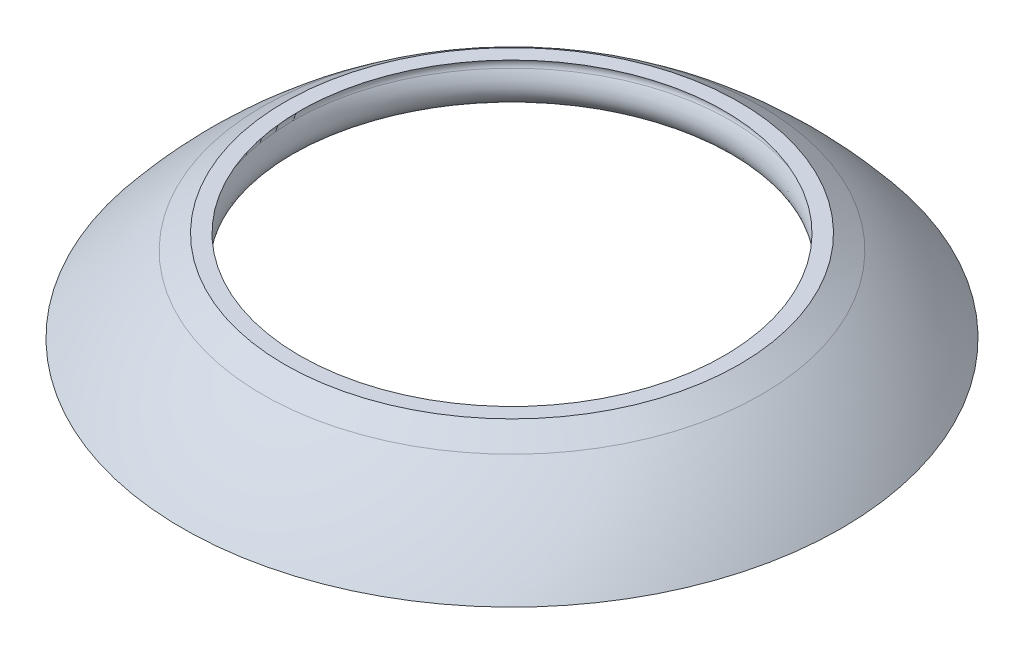
ISO-10303-21;
HEADER;
FILE_DESCRIPTION(('STEP AP214'),'2;1');
FILE_NAME('part.step','',(''),(''),'','','');
FILE_SCHEMA(('AUTOMOTIVE_DESIGN { 1 0 10303 214 1 1 1 1 }'));
ENDSEC;
DATA;
#1=APPLICATION_CONTEXT('core data for automotive mechanical design processes');
#2=APPLICATION_PROTOCOL_DEFINITION('international standard','automotive_design',2000,#1);
#3=PRODUCT_CONTEXT('',#1,'mechanical');
#4=PRODUCT('Part','Part','',(#3));
#5=PRODUCT_RELATED_PRODUCT_CATEGORY('part','',(#4));
#6=PRODUCT_DEFINITION_FORMATION('','',#4);
#7=PRODUCT_DEFINITION_CONTEXT('part definition',#1,'design');
#8=PRODUCT_DEFINITION('design','',#6,#7);
#9=PRODUCT_DEFINITION_SHAPE('','',#8);
#10=(LENGTH_UNIT() NAMED_UNIT(*) SI_UNIT(.MILLI.,.METRE.));
#11=(NAMED_UNIT(*) PLANE_ANGLE_UNIT() SI_UNIT($,.RADIAN.));
#12=(NAMED_UNIT(*) SI_UNIT($,.STERADIAN.) SOLID_ANGLE_UNIT());
#13=UNCERTAINTY_MEASURE_WITH_UNIT(LENGTH_MEASURE(1.E-05),#10,'distance_accuracy_value','');
#14=(GEOMETRIC_REPRESENTATION_CONTEXT(3) GLOBAL_UNCERTAINTY_ASSIGNED_CONTEXT((#13)) GLOBAL_UNIT_ASSIGNED_CONTEXT((#10,
#11,#12)) REPRESENTATION_CONTEXT('',''));
#15=CARTESIAN_POINT('',(0.,0.,0.));
#16=DIRECTION('',(0.,0.,1.));
#17=DIRECTION('',(1.,0.,0.));
#18=AXIS2_PLACEMENT_3D('',#15,#16,#17);
#19=CARTESIAN_POINT('',(0.,3.87999999999923,0.));
#20=DIRECTION('',(0.,1.,0.));
#21=DIRECTION('',(0.,0.,1.));
#22=AXIS2_PLACEMENT_3D('',#19,#20,#21);
#23=TOROIDAL_SURFACE('',#22,5.49286111270737,0.2);
#24=CARTESIAN_POINT('',(0.,4.07999999999923,0.));
#25=DIRECTION('',(0.,1.,0.));
#26=DIRECTION('',(0.,0.,1.));
#27=AXIS2_PLACEMENT_3D('',#24,#25,#26);
#28=CIRCLE('',#27,5.49286111270737);
#29=CARTESIAN_POINT('',(0.,4.07999999999923,5.49286111270737));
#30=VERTEX_POINT('',#29);
#31=EDGE_CURVE('E54',#30,#30,#28,.T.);
#32=ORIENTED_EDGE('',*,*,#31,.T.);
#33=EDGE_LOOP('',(#32));
#34=FACE_BOUND('',#33,.T.);
#35=CARTESIAN_POINT('',(0.,3.77729884426788,0.));
#36=DIRECTION('',(0.,1.,0.));
#37=DIRECTION('',(0.,0.,1.));
#38=AXIS2_PLACEMENT_3D('',#35,#36,#37);
#39=CIRCLE('',#38,5.66447833973148);
#40=CARTESIAN_POINT('',(0.,3.77729884426788,5.66447833973148));
#41=VERTEX_POINT('',#40);
#42=EDGE_CURVE('E10',#41,#41,#39,.T.);
#43=ORIENTED_EDGE('',*,*,#42,.F.);
#44=EDGE_LOOP('',(#43));
#45=FACE_BOUND('',#44,.T.);
#46=ADVANCED_FACE('F35',(#34,#45),#23,.F.);
#47=CARTESIAN_POINT('',(5.66447833973148,3.77729884426788,0.));
#48=CARTESIAN_POINT('',(5.5279751095847,3.54919716740944,0.));
#49=CARTESIAN_POINT('',(5.41722874248823,2.85435998139794,0.));
#50=CARTESIAN_POINT('',(6.9838167816942,2.52194058263642,0.));
#51=CARTESIAN_POINT('',(8.08067984008828,1.91737045606787,0.));
#52=CARTESIAN_POINT('',(8.532298411183,1.72995246332986,0.));
#53=B_SPLINE_CURVE_WITH_KNOTS('',3,(#47,#48,#49,#50,#51,#52),.UNSPECIFIED.,.F.,.F.,(4,1,1,4),
(0.0655508431652009,0.226972150887283,0.688222094473368,1.),.UNSPECIFIED.);
#54=CARTESIAN_POINT('',(0.,4.46566795937997,0.));
#55=DIRECTION('',(0.,1.,0.));
#56=AXIS1_PLACEMENT('',#54,#55);
#57=SURFACE_OF_REVOLUTION('',#53,#56);
#58=CARTESIAN_POINT('',(0.,1.72995246332986,0.));
#59=DIRECTION('',(0.,1.,0.));
#60=DIRECTION('',(0.,0.,1.));
#61=AXIS2_PLACEMENT_3D('',#58,#59,#60);
#62=CIRCLE('',#61,8.53229841118299);
#63=CARTESIAN_POINT('',(8.53229841118299,1.72995246332986,0.));
#64=VERTEX_POINT('',#63);
#65=EDGE_CURVE('E41',#64,#64,#62,.T.);
#66=ORIENTED_EDGE('',*,*,#65,.F.);
#67=EDGE_LOOP('',(#66));
#68=FACE_BOUND('',#67,.T.);
#69=ORIENTED_EDGE('',*,*,#42,.T.);
#70=EDGE_LOOP('',(#69));
#71=FACE_BOUND('',#70,.T.);
#72=ADVANCED_FACE('F63',(#68,#71),#57,.T.);
#73=CARTESIAN_POINT('',(0.,-5.20489802409883,0.));
#74=DIRECTION('',(0.,1.,0.));
#75=DIRECTION('',(1.,0.,0.));
#76=AXIS2_PLACEMENT_3D('',#73,#74,#75);
#77=SPHERICAL_SURFACE('',#76,10.9951019759012);
#78=CARTESIAN_POINT('',(0.,3.69256208874024,0.));
#79=DIRECTION('',(0.,1.,0.));
#80=DIRECTION('',(0.,0.,1.));
#81=AXIS2_PLACEMENT_3D('',#78,#79,#80);
#82=CIRCLE('',#81,6.45968041012119);
#83=CARTESIAN_POINT('',(6.45968041012119,3.69256208874024,0.));
#84=VERTEX_POINT('',#83);
#85=EDGE_CURVE('E45',#84,#84,#82,.T.);
#86=CARTESIAN_POINT('',(6.45968041012119,3.69256208874024,0.));
#87=CARTESIAN_POINT('',(6.48380928765496,3.67504418994126,0.));
#88=CARTESIAN_POINT('',(6.50786690206701,3.65742813453143,0.));
#89=CARTESIAN_POINT('',(6.55583801983431,3.62200088665578,0.));
#90=CARTESIAN_POINT('',(6.57975152318956,3.60418969418997,0.));
#91=CARTESIAN_POINT('',(6.6274328340299,3.5683733483681,0.));
#92=CARTESIAN_POINT('',(6.65120064151498,3.55036819501204,0.));
#93=CARTESIAN_POINT('',(6.69858898800083,3.51416511987416,0.));
#94=CARTESIAN_POINT('',(6.7222095270016,3.49596719809234,0.));
#95=CARTESIAN_POINT('',(6.7693017729673,3.45937979039917,0.));
#96=CARTESIAN_POINT('',(6.79277347993222,3.44099030448781,0.));
#97=CARTESIAN_POINT('',(6.83956650830919,3.40402098575957,0.));
#98=CARTESIAN_POINT('',(6.86288782972123,3.38544115294269,0.));
#99=CARTESIAN_POINT('',(6.90937854337998,3.34809237015963,0.));
#100=CARTESIAN_POINT('',(6.93254793562669,3.32932342019344,0.));
#101=CARTESIAN_POINT('',(6.97873325741148,3.29159764540318,0.));
#102=CARTESIAN_POINT('',(7.00174918694955,3.2726408205791,0.));
#103=CARTESIAN_POINT('',(7.0476260599277,3.23454055079484,0.));
#104=CARTESIAN_POINT('',(7.07048700336776,3.21539710583466,0.));
#105=CARTESIAN_POINT('',(7.11605239101973,3.17692486285336,0.));
#106=CARTESIAN_POINT('',(7.13875683523164,3.15759606483224,0.));
#107=CARTESIAN_POINT('',(7.18400772165535,3.1187543950721,0.));
#108=CARTESIAN_POINT('',(7.20655416386715,3.09924152333309,0.));
#109=CARTESIAN_POINT('',(7.25148755397665,3.06003299766387,0.));
#110=CARTESIAN_POINT('',(7.27387450187435,3.04033734373366,0.));
#111=CARTESIAN_POINT('',(7.31848742159835,3.00076455730679,0.));
#112=CARTESIAN_POINT('',(7.34071339342465,2.98088742481013,0.));
#113=CARTESIAN_POINT('',(7.38500288990327,2.94095299688689,0.));
#114=CARTESIAN_POINT('',(7.4070664145556,2.9208957014603,0.));
#115=CARTESIAN_POINT('',(7.45102955633585,2.88060227523845,0.));
#116=CARTESIAN_POINT('',(7.47292917346378,2.86036614444318,0.));
#117=CARTESIAN_POINT('',(7.51656305069359,2.81971638688202,0.));
#118=CARTESIAN_POINT('',(7.53829731079547,2.79930276011614,0.));
#119=CARTESIAN_POINT('',(7.58159903541626,2.75829936176,0.));
#120=CARTESIAN_POINT('',(7.60316649993517,2.73770959016975,0.));
#121=CARTESIAN_POINT('',(7.64613320587304,2.6963552649699,0.));
#122=CARTESIAN_POINT('',(7.667532447292,2.67559071136029,0.));
#123=CARTESIAN_POINT('',(7.71016129064741,2.63388819649527,0.));
#124=CARTESIAN_POINT('',(7.73139089258386,2.61295023523987,0.));
#125=CARTESIAN_POINT('',(7.77367905181987,2.57090229093439,0.));
#126=CARTESIAN_POINT('',(7.79473760911943,2.54979230788432,0.));
#127=CARTESIAN_POINT('',(7.83668228524845,2.50740171722651,0.));
#128=CARTESIAN_POINT('',(7.85756840407791,2.48612110961877,0.));
#129=CARTESIAN_POINT('',(7.89916682084698,2.44339067837599,0.));
#130=CARTESIAN_POINT('',(7.91987911878658,2.42194085474095,0.));
#131=CARTESIAN_POINT('',(7.96112852286108,2.37887341117408,0.));
#132=CARTESIAN_POINT('',(7.98166562899597,2.35725579124225,0.));
#133=CARTESIAN_POINT('',(8.02256329014195,2.31385418591853,0.));
#134=CARTESIAN_POINT('',(8.04292384515304,2.29207020052665,0.));
#135=CARTESIAN_POINT('',(8.08346705641763,2.24833730613078,0.));
#136=CARTESIAN_POINT('',(8.10364971267114,2.2263883971268,0.));
#137=CARTESIAN_POINT('',(8.14383579056287,2.18232710827173,0.));
#138=CARTESIAN_POINT('',(8.1638392122011,2.16021472842064,0.));
#139=CARTESIAN_POINT('',(8.20366549686323,2.11582796145247,0.));
#140=CARTESIAN_POINT('',(8.22348835988714,2.09355357433538,0.));
#141=CARTESIAN_POINT('',(8.26295221528962,2.04884426715343,0.));
#142=CARTESIAN_POINT('',(8.28259320766818,2.02640934708857,0.));
#143=CARTESIAN_POINT('',(8.32169202172287,1.98138045890202,0.));
#144=CARTESIAN_POINT('',(8.34114984339899,1.95878649078032,0.));
#145=CARTESIAN_POINT('',(8.37988102835357,1.91344100209494,0.));
#146=CARTESIAN_POINT('',(8.39915439163203,1.89068948153125,0.));
#147=CARTESIAN_POINT('',(8.43751538341647,1.84503039327055,0.));
#148=CARTESIAN_POINT('',(8.45660301192246,1.82212282557353,0.));
#149=CARTESIAN_POINT('',(8.49459127339702,1.77615316142393,0.));
#150=CARTESIAN_POINT('',(8.51349190636559,1.75309106497134,0.));
#151=CARTESIAN_POINT('',(8.53229841118299,1.72995246332986,0.));
#152=B_SPLINE_CURVE_WITH_KNOTS('',3,(#86,#87,#88,#89,#90,#91,#92,#93,#94,#95,#96,#97,#98,#99,
#100,#101,#102,#103,#104,#105,#106,#107,#108,#109,#110,#111,#112,#113,#114,#115,#116,#117,#118,
#119,#120,#121,#122,#123,#124,#125,#126,#127,#128,#129,#130,#131,#132,#133,#134,#135,#136,#137,
#138,#139,#140,#141,#142,#143,#144,#145,#146,#147,#148,#149,#150,#151),.UNSPECIFIED.,.F.,.F.,(4,
2,2,2,2,2,2,2,2,2,2,2,2,2,2,2,2,2,2,2,2,2,2,2,2,2,2,2,2,2,2,2,4),(0.,0.0894520622282948,
0.178904124456587,0.268356186684883,0.357808248913175,0.44726031114147,0.536712373369766,
0.626164435598057,0.715616497826354,0.805068560054648,0.894520622282941,0.983972684511236,
1.07342474673953,1.16287680896782,1.25232887119612,1.34178093342441,1.43123299565271,
1.520685057881,1.6101371201093,1.69958918233759,1.78904124456588,1.87849330679418,
1.96794536902247,2.05739743125077,2.14684949347906,2.23630155570736,2.32575361793565,
2.41520568016394,2.50465774239224,2.59410980462053,2.68356186684883,2.77301392907712,
2.86246599130541),.UNSPECIFIED.);
#153=EDGE_CURVE('BSEAM66',#84,#64,#152,.T.);
#154=ORIENTED_EDGE('',*,*,#85,.F.);
#155=ORIENTED_EDGE('',*,*,#65,.T.);
#156=ORIENTED_EDGE('',*,*,#153,.T.);
#157=ORIENTED_EDGE('',*,*,#153,.F.);
#158=EDGE_LOOP('',(#154,#156,#155,#157));
#159=FACE_BOUND('',#158,.T.);
#160=ADVANCED_FACE('F66',(#159),#77,.T.);
#161=CARTESIAN_POINT('',(0.,4.07999999999923,0.));
#162=DIRECTION('',(0.,-1.,0.));
#163=DIRECTION('',(0.,0.,-1.));
#164=AXIS2_PLACEMENT_3D('',#161,#162,#163);
#165=CONICAL_SURFACE('',#164,5.8861234016712,0.9767030626215);
#166=ORIENTED_EDGE('',*,*,#85,.T.);
#167=EDGE_LOOP('',(#166));
#168=FACE_BOUND('',#167,.T.);
#169=CARTESIAN_POINT('',(0.,4.07999999999923,0.));
#170=DIRECTION('',(0.,1.,0.));
#171=DIRECTION('',(0.,0.,1.));
#172=AXIS2_PLACEMENT_3D('',#169,#170,#171);
#173=CIRCLE('',#172,5.8861234016712);
#174=CARTESIAN_POINT('',(0.,4.07999999999923,5.8861234016712));
#175=VERTEX_POINT('',#174);
#176=EDGE_CURVE('E49',#175,#175,#173,.T.);
#177=ORIENTED_EDGE('',*,*,#176,.F.);
#178=EDGE_LOOP('',(#177));
#179=FACE_BOUND('',#178,.T.);
#180=ADVANCED_FACE('F70',(#168,#179),#165,.T.);
#181=CARTESIAN_POINT('',(3.16969974241801,4.07999999999923,0.));
#182=DIRECTION('',(0.,1.,0.));
#183=DIRECTION('',(0.,0.,1.));
#184=AXIS2_PLACEMENT_3D('',#181,#182,#183);
#185=PLANE('',#184);
#186=ORIENTED_EDGE('',*,*,#176,.T.);
#187=EDGE_LOOP('',(#186));
#188=FACE_BOUND('',#187,.T.);
#189=ORIENTED_EDGE('',*,*,#31,.F.);
#190=EDGE_LOOP('',(#189));
#191=FACE_BOUND('',#190,.T.);
#192=ADVANCED_FACE('F74',(#188,#191),#185,.T.);
#193=CLOSED_SHELL('',(#46,#72,#160,#180,#192));
#194=MANIFOLD_SOLID_BREP('B2',#193);
#195=ADVANCED_BREP_SHAPE_REPRESENTATION('',(#18,#194),#14);
#196=SHAPE_DEFINITION_REPRESENTATION(#9,#195);
ENDSEC;
END-ISO-10303-21;
